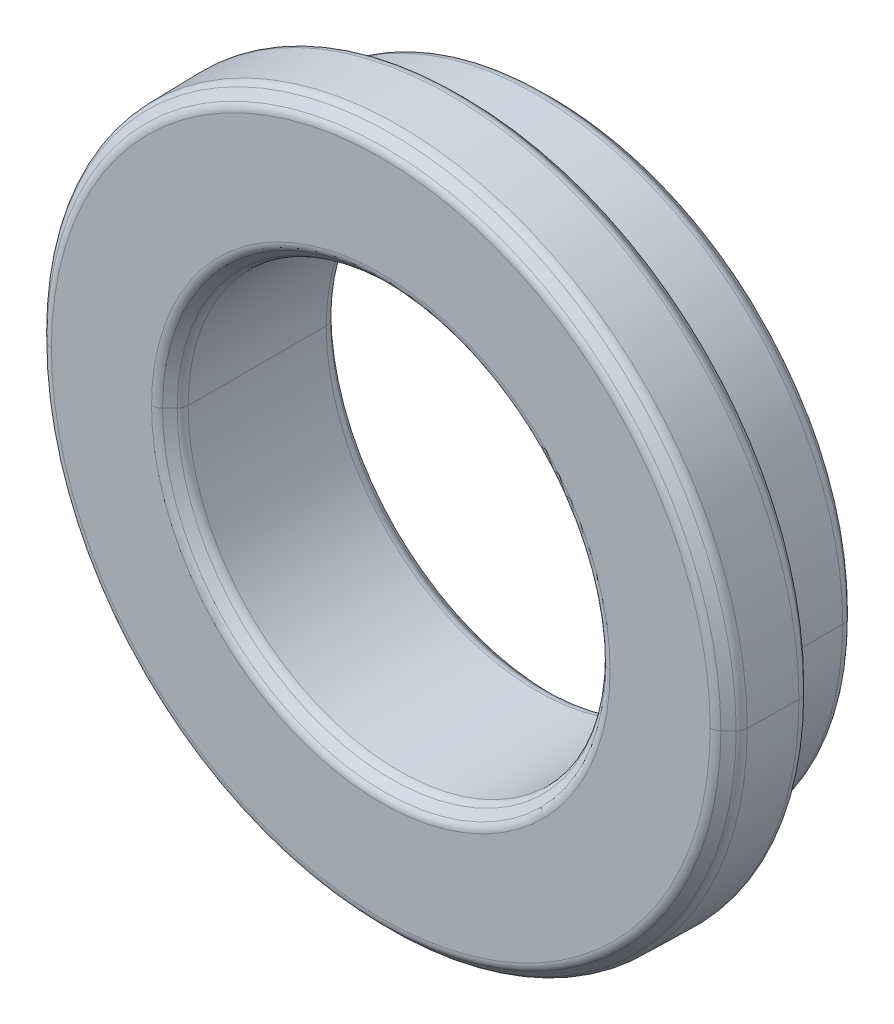
ISO-10303-21;
HEADER;
FILE_DESCRIPTION(('STEP AP214'),'2;1');
FILE_NAME('part.step','',(''),(''),'','','');
FILE_SCHEMA(('AUTOMOTIVE_DESIGN { 1 0 10303 214 1 1 1 1 }'));
ENDSEC;
DATA;
#1=APPLICATION_CONTEXT('core data for automotive mechanical design processes');
#2=APPLICATION_PROTOCOL_DEFINITION('international standard','automotive_design',2000,#1);
#3=PRODUCT_CONTEXT('',#1,'mechanical');
#4=PRODUCT('Part','Part','',(#3));
#5=PRODUCT_RELATED_PRODUCT_CATEGORY('part','',(#4));
#6=PRODUCT_DEFINITION_FORMATION('','',#4);
#7=PRODUCT_DEFINITION_CONTEXT('part definition',#1,'design');
#8=PRODUCT_DEFINITION('design','',#6,#7);
#9=PRODUCT_DEFINITION_SHAPE('','',#8);
#10=(LENGTH_UNIT() NAMED_UNIT(*) SI_UNIT(.MILLI.,.METRE.));
#11=(NAMED_UNIT(*) PLANE_ANGLE_UNIT() SI_UNIT($,.RADIAN.));
#12=(NAMED_UNIT(*) SI_UNIT($,.STERADIAN.) SOLID_ANGLE_UNIT());
#13=UNCERTAINTY_MEASURE_WITH_UNIT(LENGTH_MEASURE(1.E-05),#10,'distance_accuracy_value','');
#14=(GEOMETRIC_REPRESENTATION_CONTEXT(3) GLOBAL_UNCERTAINTY_ASSIGNED_CONTEXT((#13)) GLOBAL_UNIT_ASSIGNED_CONTEXT((#10,
#11,#12)) REPRESENTATION_CONTEXT('',''));
#15=CARTESIAN_POINT('',(0.,0.,0.));
#16=DIRECTION('',(0.,0.,1.));
#17=DIRECTION('',(1.,0.,0.));
#18=AXIS2_PLACEMENT_3D('',#15,#16,#17);
#19=CARTESIAN_POINT('',(0.,0.,1.3875));
#20=DIRECTION('',(0.,0.,-1.));
#21=DIRECTION('',(-1.,0.,0.));
#22=AXIS2_PLACEMENT_3D('',#19,#20,#21);
#23=TOROIDAL_SURFACE('',#22,5.98700479149173,0.2);
#24=CARTESIAN_POINT('',(5.98700479149173,0.,1.3875));
#25=DIRECTION('',(0.,1.,0.));
#26=DIRECTION('',(-1.,0.,0.));
#27=AXIS2_PLACEMENT_3D('',#24,#25,#26);
#28=CIRCLE('',#27,0.2);
#29=CARTESIAN_POINT('',(5.98700479149173,0.,1.5875));
#30=VERTEX_POINT('',#29);
#31=CARTESIAN_POINT('',(6.12593646558353,0.,1.53136796006773));
#32=VERTEX_POINT('',#31);
#33=EDGE_CURVE('E277',#30,#32,#28,.T.);
#34=ORIENTED_EDGE('',*,*,#33,.F.);
#35=CARTESIAN_POINT('',(0.,0.,1.5875));
#36=DIRECTION('',(0.,0.,1.));
#37=DIRECTION('',(-1.,0.,0.));
#38=AXIS2_PLACEMENT_3D('',#35,#36,#37);
#39=CIRCLE('',#38,5.98700479149173);
#40=CARTESIAN_POINT('',(-5.98700479149173,0.,1.5875));
#41=VERTEX_POINT('',#40);
#42=EDGE_CURVE('E172',#41,#30,#39,.T.);
#43=ORIENTED_EDGE('',*,*,#42,.F.);
#44=CARTESIAN_POINT('',(-5.98700479149173,0.,1.3875));
#45=DIRECTION('',(0.,-1.,0.));
#46=DIRECTION('',(0.,0.,-1.));
#47=AXIS2_PLACEMENT_3D('',#44,#45,#46);
#48=CIRCLE('',#47,0.2);
#49=CARTESIAN_POINT('',(-6.12593646558353,0.,1.53136796006773));
#50=VERTEX_POINT('',#49);
#51=EDGE_CURVE('E187',#41,#50,#48,.T.);
#52=ORIENTED_EDGE('',*,*,#51,.T.);
#53=CARTESIAN_POINT('',(0.,0.,1.53136796006773));
#54=DIRECTION('',(0.,0.,-1.));
#55=DIRECTION('',(-1.,0.,0.));
#56=AXIS2_PLACEMENT_3D('',#53,#54,#55);
#57=CIRCLE('',#56,6.12593646558353);
#58=EDGE_CURVE('E196',#32,#50,#57,.T.);
#59=ORIENTED_EDGE('',*,*,#58,.F.);
#60=EDGE_LOOP('',(#34,#43,#52,#59));
#61=FACE_BOUND('',#60,.T.);
#62=ADVANCED_FACE('F16',(#61),#23,.T.);
#63=CARTESIAN_POINT('',(0.,0.,1.3875));
#64=DIRECTION('',(0.,0.,-1.));
#65=DIRECTION('',(-1.,0.,0.));
#66=AXIS2_PLACEMENT_3D('',#63,#64,#65);
#67=TOROIDAL_SURFACE('',#66,4.16784271247462,0.2);
#68=CARTESIAN_POINT('',(4.16784271247462,0.,1.3875));
#69=DIRECTION('',(0.,1.,0.));
#70=DIRECTION('',(-1.,0.,0.));
#71=AXIS2_PLACEMENT_3D('',#68,#69,#70);
#72=CIRCLE('',#71,0.2);
#73=CARTESIAN_POINT('',(4.02642135623731,0.,1.5289213562373));
#74=VERTEX_POINT('',#73);
#75=CARTESIAN_POINT('',(4.16784271247462,0.,1.5875));
#76=VERTEX_POINT('',#75);
#77=EDGE_CURVE('E165',#74,#76,#72,.T.);
#78=ORIENTED_EDGE('',*,*,#77,.F.);
#79=CARTESIAN_POINT('',(0.,0.,1.5289213562373));
#80=DIRECTION('',(0.,0.,1.));
#81=DIRECTION('',(1.,0.,0.));
#82=AXIS2_PLACEMENT_3D('',#79,#80,#81);
#83=CIRCLE('',#82,4.02642135623732);
#84=CARTESIAN_POINT('',(-4.02642135623731,0.,1.5289213562373));
#85=VERTEX_POINT('',#84);
#86=EDGE_CURVE('E201',#85,#74,#83,.T.);
#87=ORIENTED_EDGE('',*,*,#86,.F.);
#88=CARTESIAN_POINT('',(-4.16784271247462,0.,1.3875));
#89=DIRECTION('',(0.,-1.,0.));
#90=DIRECTION('',(0.,0.,-1.));
#91=AXIS2_PLACEMENT_3D('',#88,#89,#90);
#92=CIRCLE('',#91,0.2);
#93=CARTESIAN_POINT('',(-4.16784271247462,0.,1.5875));
#94=VERTEX_POINT('',#93);
#95=EDGE_CURVE('E168',#85,#94,#92,.T.);
#96=ORIENTED_EDGE('',*,*,#95,.T.);
#97=CARTESIAN_POINT('',(0.,0.,1.5875));
#98=DIRECTION('',(0.,0.,-1.));
#99=DIRECTION('',(-1.,0.,0.));
#100=AXIS2_PLACEMENT_3D('',#97,#98,#99);
#101=CIRCLE('',#100,4.16784271247462);
#102=EDGE_CURVE('E152',#76,#94,#101,.T.);
#103=ORIENTED_EDGE('',*,*,#102,.F.);
#104=EDGE_LOOP('',(#78,#87,#96,#103));
#105=FACE_BOUND('',#104,.T.);
#106=ADVANCED_FACE('F163',(#105),#67,.T.);
#107=CARTESIAN_POINT('',(0.,0.,1.25465728752538));
#108=DIRECTION('',(0.,0.,-1.));
#109=DIRECTION('',(-1.,0.,0.));
#110=AXIS2_PLACEMENT_3D('',#107,#108,#109);
#111=TOROIDAL_SURFACE('',#110,4.035,0.2);
#112=CARTESIAN_POINT('',(4.035,0.,1.25465728752538));
#113=DIRECTION('',(0.,1.,0.));
#114=DIRECTION('',(-1.,0.,0.));
#115=AXIS2_PLACEMENT_3D('',#112,#113,#114);
#116=CIRCLE('',#115,0.2);
#117=CARTESIAN_POINT('',(3.835,0.,1.25465728752538));
#118=VERTEX_POINT('',#117);
#119=CARTESIAN_POINT('',(3.89357864376269,0.,1.39607864376268));
#120=VERTEX_POINT('',#119);
#121=EDGE_CURVE('E396',#118,#120,#116,.T.);
#122=ORIENTED_EDGE('',*,*,#121,.F.);
#123=CARTESIAN_POINT('',(0.,0.,1.25465728752538));
#124=DIRECTION('',(0.,0.,1.));
#125=DIRECTION('',(-1.,0.,0.));
#126=AXIS2_PLACEMENT_3D('',#123,#124,#125);
#127=CIRCLE('',#126,3.835);
#128=CARTESIAN_POINT('',(-3.835,0.,1.25465728752538));
#129=VERTEX_POINT('',#128);
#130=EDGE_CURVE('E301',#129,#118,#127,.T.);
#131=ORIENTED_EDGE('',*,*,#130,.F.);
#132=CARTESIAN_POINT('',(-4.035,0.,1.25465728752538));
#133=DIRECTION('',(0.,-1.,0.));
#134=DIRECTION('',(0.,0.,-1.));
#135=AXIS2_PLACEMENT_3D('',#132,#133,#134);
#136=CIRCLE('',#135,0.2);
#137=CARTESIAN_POINT('',(-3.89357864376269,0.,1.39607864376268));
#138=VERTEX_POINT('',#137);
#139=EDGE_CURVE('E321',#129,#138,#136,.T.);
#140=ORIENTED_EDGE('',*,*,#139,.T.);
#141=CARTESIAN_POINT('',(0.,0.,1.39607864376268));
#142=DIRECTION('',(0.,0.,-1.));
#143=DIRECTION('',(1.,0.,0.));
#144=AXIS2_PLACEMENT_3D('',#141,#142,#143);
#145=CIRCLE('',#144,3.89357864376269);
#146=EDGE_CURVE('E202',#120,#138,#145,.T.);
#147=ORIENTED_EDGE('',*,*,#146,.F.);
#148=EDGE_LOOP('',(#122,#131,#140,#147));
#149=FACE_BOUND('',#148,.T.);
#150=ADVANCED_FACE('F622',(#149),#111,.T.);
#151=CARTESIAN_POINT('',(0.,0.,-1.25465728752537));
#152=DIRECTION('',(0.,0.,1.));
#153=DIRECTION('',(1.,0.,0.));
#154=AXIS2_PLACEMENT_3D('',#151,#152,#153);
#155=TOROIDAL_SURFACE('',#154,4.035,0.2);
#156=CARTESIAN_POINT('',(-4.035,0.,-1.25465728752537));
#157=DIRECTION('',(0.,1.,0.));
#158=DIRECTION('',(-1.,0.,0.));
#159=AXIS2_PLACEMENT_3D('',#156,#157,#158);
#160=CIRCLE('',#159,0.2);
#161=CARTESIAN_POINT('',(-3.835,0.,-1.25465728752537));
#162=VERTEX_POINT('',#161);
#163=CARTESIAN_POINT('',(-3.89357864376269,0.,-1.39607864376268));
#164=VERTEX_POINT('',#163);
#165=EDGE_CURVE('E320',#162,#164,#160,.T.);
#166=ORIENTED_EDGE('',*,*,#165,.F.);
#167=CARTESIAN_POINT('',(0.,0.,-1.25465728752537));
#168=DIRECTION('',(0.,0.,-1.));
#169=DIRECTION('',(1.,0.,0.));
#170=AXIS2_PLACEMENT_3D('',#167,#168,#169);
#171=CIRCLE('',#170,3.835);
#172=CARTESIAN_POINT('',(3.835,0.,-1.25465728752537));
#173=VERTEX_POINT('',#172);
#174=EDGE_CURVE('E302',#173,#162,#171,.T.);
#175=ORIENTED_EDGE('',*,*,#174,.F.);
#176=CARTESIAN_POINT('',(4.035,0.,-1.25465728752537));
#177=DIRECTION('',(0.,-1.,0.));
#178=DIRECTION('',(0.,0.,-1.));
#179=AXIS2_PLACEMENT_3D('',#176,#177,#178);
#180=CIRCLE('',#179,0.2);
#181=CARTESIAN_POINT('',(3.89357864376269,0.,-1.39607864376268));
#182=VERTEX_POINT('',#181);
#183=EDGE_CURVE('E291',#173,#182,#180,.T.);
#184=ORIENTED_EDGE('',*,*,#183,.T.);
#185=CARTESIAN_POINT('',(0.,0.,-1.39607864376268));
#186=DIRECTION('',(0.,0.,1.));
#187=DIRECTION('',(-1.,0.,0.));
#188=AXIS2_PLACEMENT_3D('',#185,#186,#187);
#189=CIRCLE('',#188,3.89357864376269);
#190=EDGE_CURVE('E217',#164,#182,#189,.T.);
#191=ORIENTED_EDGE('',*,*,#190,.F.);
#192=EDGE_LOOP('',(#166,#175,#184,#191));
#193=FACE_BOUND('',#192,.T.);
#194=ADVANCED_FACE('F520',(#193),#155,.T.);
#195=CARTESIAN_POINT('',(0.,0.,1.25121749979519));
#196=DIRECTION('',(0.,0.,1.));
#197=DIRECTION('',(1.,0.,0.));
#198=AXIS2_PLACEMENT_3D('',#195,#196,#197);
#199=TOROIDAL_SURFACE('',#198,6.12812945169297,0.2);
#200=CARTESIAN_POINT('',(-6.12812945169297,0.,1.25121749979519));
#201=DIRECTION('',(0.,1.,0.));
#202=DIRECTION('',(-1.,0.,0.));
#203=AXIS2_PLACEMENT_3D('',#200,#201,#202);
#204=CIRCLE('',#203,0.2);
#205=CARTESIAN_POINT('',(-6.32809899072425,0.,1.25470798108265));
#206=VERTEX_POINT('',#205);
#207=CARTESIAN_POINT('',(-6.26706112578477,0.,1.39508545986292));
#208=VERTEX_POINT('',#207);
#209=EDGE_CURVE('E369',#206,#208,#204,.T.);
#210=ORIENTED_EDGE('',*,*,#209,.F.);
#211=CARTESIAN_POINT('',(0.,0.,1.25470798108265));
#212=DIRECTION('',(0.,0.,-1.));
#213=DIRECTION('',(-1.,0.,0.));
#214=AXIS2_PLACEMENT_3D('',#211,#212,#213);
#215=CIRCLE('',#214,6.32809899072425);
#216=CARTESIAN_POINT('',(6.32809899072425,0.,1.25470798108265));
#217=VERTEX_POINT('',#216);
#218=EDGE_CURVE('E264',#217,#206,#215,.T.);
#219=ORIENTED_EDGE('',*,*,#218,.F.);
#220=CARTESIAN_POINT('',(6.12812945169297,0.,1.25121749979519));
#221=DIRECTION('',(0.,-1.,0.));
#222=DIRECTION('',(0.,0.,-1.));
#223=AXIS2_PLACEMENT_3D('',#220,#221,#222);
#224=CIRCLE('',#223,0.2);
#225=CARTESIAN_POINT('',(6.26706112578477,0.,1.39508545986292));
#226=VERTEX_POINT('',#225);
#227=EDGE_CURVE('E331',#217,#226,#224,.T.);
#228=ORIENTED_EDGE('',*,*,#227,.T.);
#229=CARTESIAN_POINT('',(0.,0.,1.39508545986292));
#230=DIRECTION('',(0.,0.,1.));
#231=DIRECTION('',(-1.,0.,0.));
#232=AXIS2_PLACEMENT_3D('',#229,#230,#231);
#233=CIRCLE('',#232,6.26706112578477);
#234=EDGE_CURVE('E192',#208,#226,#233,.T.);
#235=ORIENTED_EDGE('',*,*,#234,.F.);
#236=EDGE_LOOP('',(#210,#219,#228,#235));
#237=FACE_BOUND('',#236,.T.);
#238=ADVANCED_FACE('F649',(#237),#199,.T.);
#239=CARTESIAN_POINT('',(0.,0.,0.327102648891243));
#240=DIRECTION('',(0.,0.,-1.));
#241=DIRECTION('',(-1.,0.,0.));
#242=AXIS2_PLACEMENT_3D('',#239,#240,#241);
#243=TOROIDAL_SURFACE('',#242,6.14425993641663,0.2);
#244=CARTESIAN_POINT('',(6.14425993641663,0.,0.327102648891243));
#245=DIRECTION('',(0.,1.,0.));
#246=DIRECTION('',(-1.,0.,0.));
#247=AXIS2_PLACEMENT_3D('',#244,#245,#246);
#248=CIRCLE('',#247,0.2);
#249=CARTESIAN_POINT('',(6.34422947544791,0.,0.3305931301787));
#250=VERTEX_POINT('',#249);
#251=CARTESIAN_POINT('',(6.28568129265394,0.,0.185681292653931));
#252=VERTEX_POINT('',#251);
#253=EDGE_CURVE('E330',#250,#252,#248,.T.);
#254=ORIENTED_EDGE('',*,*,#253,.F.);
#255=CARTESIAN_POINT('',(0.,0.,0.3305931301787));
#256=DIRECTION('',(0.,0.,1.));
#257=DIRECTION('',(-1.,0.,0.));
#258=AXIS2_PLACEMENT_3D('',#255,#256,#257);
#259=CIRCLE('',#258,6.34422947544791);
#260=CARTESIAN_POINT('',(-6.34422947544791,0.,0.3305931301787));
#261=VERTEX_POINT('',#260);
#262=EDGE_CURVE('E276',#261,#250,#259,.T.);
#263=ORIENTED_EDGE('',*,*,#262,.F.);
#264=CARTESIAN_POINT('',(-6.14425993641663,0.,0.327102648891243));
#265=DIRECTION('',(0.,-1.,0.));
#266=DIRECTION('',(0.,0.,-1.));
#267=AXIS2_PLACEMENT_3D('',#264,#265,#266);
#268=CIRCLE('',#267,0.2);
#269=CARTESIAN_POINT('',(-6.28568129265394,0.,0.185681292653931));
#270=VERTEX_POINT('',#269);
#271=EDGE_CURVE('E236',#261,#270,#268,.T.);
#272=ORIENTED_EDGE('',*,*,#271,.T.);
#273=CARTESIAN_POINT('',(0.,0.,0.185681292653931));
#274=DIRECTION('',(0.,0.,-1.));
#275=DIRECTION('',(1.,0.,0.));
#276=AXIS2_PLACEMENT_3D('',#273,#274,#275);
#277=CIRCLE('',#276,6.28568129265394);
#278=EDGE_CURVE('E206',#252,#270,#277,.T.);
#279=ORIENTED_EDGE('',*,*,#278,.F.);
#280=EDGE_LOOP('',(#254,#263,#272,#279));
#281=FACE_BOUND('',#280,.T.);
#282=ADVANCED_FACE('F646',(#281),#243,.T.);
#283=CARTESIAN_POINT('',(0.,0.,0.2));
#284=DIRECTION('',(0.,0.,1.));
#285=DIRECTION('',(1.,0.,0.));
#286=AXIS2_PLACEMENT_3D('',#283,#284,#285);
#287=TOROIDAL_SURFACE('',#286,6.01715728752538,0.2);
#288=CARTESIAN_POINT('',(-6.01715728752538,0.,0.2));
#289=DIRECTION('',(0.,1.,0.));
#290=DIRECTION('',(-1.,0.,0.));
#291=AXIS2_PLACEMENT_3D('',#288,#289,#290);
#292=CIRCLE('',#291,0.2);
#293=CARTESIAN_POINT('',(-6.01715728752538,0.,0.));
#294=VERTEX_POINT('',#293);
#295=CARTESIAN_POINT('',(-6.15857864376269,0.,0.0585786437626874));
#296=VERTEX_POINT('',#295);
#297=EDGE_CURVE('E218',#294,#296,#292,.T.);
#298=ORIENTED_EDGE('',*,*,#297,.F.);
#299=CARTESIAN_POINT('',(0.,0.,0.));
#300=DIRECTION('',(0.,0.,-1.));
#301=DIRECTION('',(1.,0.,0.));
#302=AXIS2_PLACEMENT_3D('',#299,#300,#301);
#303=CIRCLE('',#302,6.01715728752538);
#304=CARTESIAN_POINT('',(6.01715728752538,0.,0.));
#305=VERTEX_POINT('',#304);
#306=EDGE_CURVE('E306',#305,#294,#303,.T.);
#307=ORIENTED_EDGE('',*,*,#306,.F.);
#308=CARTESIAN_POINT('',(6.01715728752538,0.,0.2));
#309=DIRECTION('',(0.,-1.,0.));
#310=DIRECTION('',(0.,0.,-1.));
#311=AXIS2_PLACEMENT_3D('',#308,#309,#310);
#312=CIRCLE('',#311,0.2);
#313=CARTESIAN_POINT('',(6.15857864376269,0.,0.0585786437626874));
#314=VERTEX_POINT('',#313);
#315=EDGE_CURVE('E373',#305,#314,#312,.T.);
#316=ORIENTED_EDGE('',*,*,#315,.T.);
#317=CARTESIAN_POINT('',(0.,0.,0.0585786437626874));
#318=DIRECTION('',(0.,0.,1.));
#319=DIRECTION('',(1.,0.,0.));
#320=AXIS2_PLACEMENT_3D('',#317,#318,#319);
#321=CIRCLE('',#320,6.15857864376269);
#322=EDGE_CURVE('E195',#296,#314,#321,.T.);
#323=ORIENTED_EDGE('',*,*,#322,.F.);
#324=EDGE_LOOP('',(#298,#307,#316,#323));
#325=FACE_BOUND('',#324,.T.);
#326=ADVANCED_FACE('F594',(#325),#287,.T.);
#327=CARTESIAN_POINT('',(0.,0.,-0.2));
#328=DIRECTION('',(0.,0.,1.));
#329=DIRECTION('',(1.,0.,0.));
#330=AXIS2_PLACEMENT_3D('',#327,#328,#329);
#331=TOROIDAL_SURFACE('',#330,5.75625,0.2);
#332=CARTESIAN_POINT('',(-5.75625,0.,-0.2));
#333=DIRECTION('',(0.,1.,0.));
#334=DIRECTION('',(-1.,0.,0.));
#335=AXIS2_PLACEMENT_3D('',#332,#333,#334);
#336=CIRCLE('',#335,0.2);
#337=CARTESIAN_POINT('',(-5.75625,0.,0.));
#338=VERTEX_POINT('',#337);
#339=CARTESIAN_POINT('',(-5.55625,0.,-0.2));
#340=VERTEX_POINT('',#339);
#341=EDGE_CURVE('E387',#338,#340,#336,.T.);
#342=ORIENTED_EDGE('',*,*,#341,.F.);
#343=CARTESIAN_POINT('',(0.,0.,0.));
#344=DIRECTION('',(0.,0.,1.));
#345=DIRECTION('',(1.,0.,0.));
#346=AXIS2_PLACEMENT_3D('',#343,#344,#345);
#347=CIRCLE('',#346,5.75625);
#348=CARTESIAN_POINT('',(5.75625,0.,0.));
#349=VERTEX_POINT('',#348);
#350=EDGE_CURVE('E310',#349,#338,#347,.T.);
#351=ORIENTED_EDGE('',*,*,#350,.F.);
#352=CARTESIAN_POINT('',(5.75625,0.,-0.2));
#353=DIRECTION('',(0.,-1.,0.));
#354=DIRECTION('',(0.,0.,-1.));
#355=AXIS2_PLACEMENT_3D('',#352,#353,#354);
#356=CIRCLE('',#355,0.2);
#357=CARTESIAN_POINT('',(5.55625,0.,-0.2));
#358=VERTEX_POINT('',#357);
#359=EDGE_CURVE('E335',#349,#358,#356,.T.);
#360=ORIENTED_EDGE('',*,*,#359,.T.);
#361=CARTESIAN_POINT('',(0.,0.,-0.2));
#362=DIRECTION('',(0.,0.,-1.));
#363=DIRECTION('',(1.,0.,0.));
#364=AXIS2_PLACEMENT_3D('',#361,#362,#363);
#365=CIRCLE('',#364,5.55625);
#366=EDGE_CURVE('E426',#340,#358,#365,.T.);
#367=ORIENTED_EDGE('',*,*,#366,.F.);
#368=EDGE_LOOP('',(#342,#351,#360,#367));
#369=FACE_BOUND('',#368,.T.);
#370=ADVANCED_FACE('F654',(#369),#331,.F.);
#371=CARTESIAN_POINT('',(0.,0.,-1.25465728752538));
#372=DIRECTION('',(0.,0.,-1.));
#373=DIRECTION('',(-1.,0.,0.));
#374=AXIS2_PLACEMENT_3D('',#371,#372,#373);
#375=TOROIDAL_SURFACE('',#374,5.35625,0.2);
#376=CARTESIAN_POINT('',(5.35625,0.,-1.25465728752538));
#377=DIRECTION('',(0.,1.,0.));
#378=DIRECTION('',(-1.,0.,0.));
#379=AXIS2_PLACEMENT_3D('',#376,#377,#378);
#380=CIRCLE('',#379,0.2);
#381=CARTESIAN_POINT('',(5.55625,0.,-1.25465728752538));
#382=VERTEX_POINT('',#381);
#383=CARTESIAN_POINT('',(5.49767135623731,0.,-1.39607864376269));
#384=VERTEX_POINT('',#383);
#385=EDGE_CURVE('E341',#382,#384,#380,.T.);
#386=ORIENTED_EDGE('',*,*,#385,.F.);
#387=CARTESIAN_POINT('',(0.,0.,-1.25465728752538));
#388=DIRECTION('',(0.,0.,1.));
#389=DIRECTION('',(-1.,0.,0.));
#390=AXIS2_PLACEMENT_3D('',#387,#388,#389);
#391=CIRCLE('',#390,5.55625);
#392=CARTESIAN_POINT('',(-5.55625,0.,-1.25465728752538));
#393=VERTEX_POINT('',#392);
#394=EDGE_CURVE('E311',#393,#382,#391,.T.);
#395=ORIENTED_EDGE('',*,*,#394,.F.);
#396=CARTESIAN_POINT('',(-5.35625,0.,-1.25465728752538));
#397=DIRECTION('',(0.,-1.,0.));
#398=DIRECTION('',(0.,0.,-1.));
#399=AXIS2_PLACEMENT_3D('',#396,#397,#398);
#400=CIRCLE('',#399,0.2);
#401=CARTESIAN_POINT('',(-5.49767135623731,0.,-1.39607864376269));
#402=VERTEX_POINT('',#401);
#403=EDGE_CURVE('E357',#393,#402,#400,.T.);
#404=ORIENTED_EDGE('',*,*,#403,.T.);
#405=CARTESIAN_POINT('',(0.,0.,-1.39607864376269));
#406=DIRECTION('',(0.,0.,-1.));
#407=DIRECTION('',(1.,0.,0.));
#408=AXIS2_PLACEMENT_3D('',#405,#406,#407);
#409=CIRCLE('',#408,5.49767135623731);
#410=EDGE_CURVE('E10',#384,#402,#409,.T.);
#411=ORIENTED_EDGE('',*,*,#410,.F.);
#412=EDGE_LOOP('',(#386,#395,#404,#411));
#413=FACE_BOUND('',#412,.T.);
#414=ADVANCED_FACE('F657',(#413),#375,.T.);
#415=CARTESIAN_POINT('',(0.,0.,-1.3875));
#416=DIRECTION('',(0.,0.,1.));
#417=DIRECTION('',(1.,0.,0.));
#418=AXIS2_PLACEMENT_3D('',#415,#416,#417);
#419=TOROIDAL_SURFACE('',#418,5.22340728752538,0.2);
#420=CARTESIAN_POINT('',(-5.22340728752538,0.,-1.3875));
#421=DIRECTION('',(0.,1.,0.));
#422=DIRECTION('',(-1.,0.,0.));
#423=AXIS2_PLACEMENT_3D('',#420,#421,#422);
#424=CIRCLE('',#423,0.2);
#425=CARTESIAN_POINT('',(-5.22340728752538,0.,-1.5875));
#426=VERTEX_POINT('',#425);
#427=CARTESIAN_POINT('',(-5.36482864376269,0.,-1.5289213562373));
#428=VERTEX_POINT('',#427);
#429=EDGE_CURVE('E241',#426,#428,#424,.T.);
#430=ORIENTED_EDGE('',*,*,#429,.F.);
#431=CARTESIAN_POINT('',(0.,0.,-1.5875));
#432=DIRECTION('',(0.,0.,-1.));
#433=DIRECTION('',(1.,0.,0.));
#434=AXIS2_PLACEMENT_3D('',#431,#432,#433);
#435=CIRCLE('',#434,5.22340728752538);
#436=CARTESIAN_POINT('',(5.22340728752538,0.,-1.5875));
#437=VERTEX_POINT('',#436);
#438=EDGE_CURVE('E171',#437,#426,#435,.T.);
#439=ORIENTED_EDGE('',*,*,#438,.F.);
#440=CARTESIAN_POINT('',(5.22340728752538,0.,-1.3875));
#441=DIRECTION('',(0.,-1.,0.));
#442=DIRECTION('',(0.,0.,-1.));
#443=AXIS2_PLACEMENT_3D('',#440,#441,#442);
#444=CIRCLE('',#443,0.2);
#445=CARTESIAN_POINT('',(5.36482864376269,0.,-1.5289213562373));
#446=VERTEX_POINT('',#445);
#447=EDGE_CURVE('E240',#437,#446,#444,.T.);
#448=ORIENTED_EDGE('',*,*,#447,.T.);
#449=CARTESIAN_POINT('',(0.,0.,-1.5289213562373));
#450=DIRECTION('',(0.,0.,1.));
#451=DIRECTION('',(1.,0.,0.));
#452=AXIS2_PLACEMENT_3D('',#449,#450,#451);
#453=CIRCLE('',#452,5.36482864376269);
#454=EDGE_CURVE('E27',#428,#446,#453,.T.);
#455=ORIENTED_EDGE('',*,*,#454,.F.);
#456=EDGE_LOOP('',(#430,#439,#448,#455));
#457=FACE_BOUND('',#456,.T.);
#458=ADVANCED_FACE('F866',(#457),#419,.T.);
#459=CARTESIAN_POINT('',(0.,0.,-1.3875));
#460=DIRECTION('',(0.,0.,1.));
#461=DIRECTION('',(1.,0.,0.));
#462=AXIS2_PLACEMENT_3D('',#459,#460,#461);
#463=TOROIDAL_SURFACE('',#462,4.16784271247462,0.2);
#464=CARTESIAN_POINT('',(-4.16784271247462,0.,-1.3875));
#465=DIRECTION('',(0.,1.,0.));
#466=DIRECTION('',(-1.,0.,0.));
#467=AXIS2_PLACEMENT_3D('',#464,#465,#466);
#468=CIRCLE('',#467,0.2);
#469=CARTESIAN_POINT('',(-4.02642135623731,0.,-1.5289213562373));
#470=VERTEX_POINT('',#469);
#471=CARTESIAN_POINT('',(-4.16784271247462,0.,-1.5875));
#472=VERTEX_POINT('',#471);
#473=EDGE_CURVE('E224',#470,#472,#468,.T.);
#474=ORIENTED_EDGE('',*,*,#473,.F.);
#475=CARTESIAN_POINT('',(0.,0.,-1.5289213562373));
#476=DIRECTION('',(0.,0.,-1.));
#477=DIRECTION('',(-1.,0.,0.));
#478=AXIS2_PLACEMENT_3D('',#475,#476,#477);
#479=CIRCLE('',#478,4.02642135623731);
#480=CARTESIAN_POINT('',(4.02642135623731,0.,-1.5289213562373));
#481=VERTEX_POINT('',#480);
#482=EDGE_CURVE('E286',#481,#470,#479,.T.);
#483=ORIENTED_EDGE('',*,*,#482,.F.);
#484=CARTESIAN_POINT('',(4.16784271247462,0.,-1.3875));
#485=DIRECTION('',(0.,-1.,0.));
#486=DIRECTION('',(0.,0.,-1.));
#487=AXIS2_PLACEMENT_3D('',#484,#485,#486);
#488=CIRCLE('',#487,0.2);
#489=CARTESIAN_POINT('',(4.16784271247462,0.,-1.5875));
#490=VERTEX_POINT('',#489);
#491=EDGE_CURVE('E232',#481,#490,#488,.T.);
#492=ORIENTED_EDGE('',*,*,#491,.T.);
#493=CARTESIAN_POINT('',(0.,0.,-1.5875));
#494=DIRECTION('',(0.,0.,1.));
#495=DIRECTION('',(1.,0.,0.));
#496=AXIS2_PLACEMENT_3D('',#493,#494,#495);
#497=CIRCLE('',#496,4.16784271247462);
#498=EDGE_CURVE('E41',#472,#490,#497,.T.);
#499=ORIENTED_EDGE('',*,*,#498,.F.);
#500=EDGE_LOOP('',(#474,#483,#492,#499));
#501=FACE_BOUND('',#500,.T.);
#502=ADVANCED_FACE('F18',(#501),#463,.T.);
#503=CARTESIAN_POINT('',(0.,0.,1.3375));
#504=DIRECTION('',(0.,0.,1.));
#505=DIRECTION('',(1.,0.,0.));
#506=AXIS2_PLACEMENT_3D('',#503,#504,#505);
#507=CONICAL_SURFACE('',#506,3.835,0.785398163397448);
#508=DIRECTION('',(-0.707106781186547,0.,0.707106781186548));
#509=VECTOR('',#508,1.);
#510=CARTESIAN_POINT('',(-3.835,0.,1.3375));
#511=LINE('',#510,#509);
#512=EDGE_CURVE('E197',#138,#85,#511,.T.);
#513=ORIENTED_EDGE('',*,*,#512,.F.);
#514=CARTESIAN_POINT('',(0.,0.,1.39607864376268));
#515=DIRECTION('',(0.,0.,-1.));
#516=DIRECTION('',(1.,0.,0.));
#517=AXIS2_PLACEMENT_3D('',#514,#515,#516);
#518=CIRCLE('',#517,3.89357864376269);
#519=EDGE_CURVE('E361',#138,#120,#518,.T.);
#520=ORIENTED_EDGE('',*,*,#519,.T.);
#521=DIRECTION('',(0.707106781186547,0.,0.707106781186548));
#522=VECTOR('',#521,1.);
#523=CARTESIAN_POINT('',(3.835,0.,1.3375));
#524=LINE('',#523,#522);
#525=EDGE_CURVE('E213',#120,#74,#524,.T.);
#526=ORIENTED_EDGE('',*,*,#525,.T.);
#527=CARTESIAN_POINT('',(0.,0.,1.5289213562373));
#528=DIRECTION('',(0.,0.,1.));
#529=DIRECTION('',(1.,0.,0.));
#530=AXIS2_PLACEMENT_3D('',#527,#528,#529);
#531=CIRCLE('',#530,4.02642135623732);
#532=EDGE_CURVE('E180',#74,#85,#531,.T.);
#533=ORIENTED_EDGE('',*,*,#532,.T.);
#534=EDGE_LOOP('',(#513,#520,#526,#533));
#535=FACE_BOUND('',#534,.T.);
#536=ADVANCED_FACE('F706',(#535),#507,.F.);
#537=CARTESIAN_POINT('',(0.,0.,-1.5875));
#538=DIRECTION('',(0.,0.,-1.));
#539=DIRECTION('',(-1.,0.,0.));
#540=AXIS2_PLACEMENT_3D('',#537,#538,#539);
#541=CONICAL_SURFACE('',#540,4.085,0.785398163397443);
#542=DIRECTION('',(0.707106781186545,0.,-0.707106781186551));
#543=VECTOR('',#542,1.);
#544=CARTESIAN_POINT('',(4.085,0.,-1.5875));
#545=LINE('',#544,#543);
#546=EDGE_CURVE('E282',#182,#481,#545,.T.);
#547=ORIENTED_EDGE('',*,*,#546,.F.);
#548=CARTESIAN_POINT('',(0.,0.,-1.39607864376268));
#549=DIRECTION('',(0.,0.,1.));
#550=DIRECTION('',(-1.,0.,0.));
#551=AXIS2_PLACEMENT_3D('',#548,#549,#550);
#552=CIRCLE('',#551,3.89357864376269);
#553=EDGE_CURVE('E295',#182,#164,#552,.T.);
#554=ORIENTED_EDGE('',*,*,#553,.T.);
#555=DIRECTION('',(-0.707106781186545,0.,-0.707106781186551));
#556=VECTOR('',#555,1.);
#557=CARTESIAN_POINT('',(-4.085,0.,-1.5875));
#558=LINE('',#557,#556);
#559=EDGE_CURVE('E404',#164,#470,#558,.T.);
#560=ORIENTED_EDGE('',*,*,#559,.T.);
#561=CARTESIAN_POINT('',(0.,0.,-1.5289213562373));
#562=DIRECTION('',(0.,0.,-1.));
#563=DIRECTION('',(-1.,0.,0.));
#564=AXIS2_PLACEMENT_3D('',#561,#562,#563);
#565=CIRCLE('',#564,4.02642135623731);
#566=EDGE_CURVE('E229',#470,#481,#565,.T.);
#567=ORIENTED_EDGE('',*,*,#566,.T.);
#568=EDGE_LOOP('',(#547,#554,#560,#567));
#569=FACE_BOUND('',#568,.T.);
#570=ADVANCED_FACE('F627',(#569),#541,.F.);
#571=CARTESIAN_POINT('',(0.,0.,-1.3375));
#572=DIRECTION('',(0.,0.,1.));
#573=DIRECTION('',(1.,0.,0.));
#574=AXIS2_PLACEMENT_3D('',#571,#572,#573);
#575=CONICAL_SURFACE('',#574,5.55625,0.785398163397448);
#576=DIRECTION('',(-0.707106781186548,0.,0.707106781186548));
#577=VECTOR('',#576,1.);
#578=CARTESIAN_POINT('',(-5.55625,0.,-1.3375));
#579=LINE('',#578,#577);
#580=EDGE_CURVE('E325',#428,#402,#579,.T.);
#581=ORIENTED_EDGE('',*,*,#580,.F.);
#582=ORIENTED_EDGE('',*,*,#454,.T.);
#583=DIRECTION('',(0.707106781186548,0.,0.707106781186548));
#584=VECTOR('',#583,1.);
#585=CARTESIAN_POINT('',(5.55625,0.,-1.3375));
#586=LINE('',#585,#584);
#587=EDGE_CURVE('E212',#446,#384,#586,.T.);
#588=ORIENTED_EDGE('',*,*,#587,.T.);
#589=ORIENTED_EDGE('',*,*,#410,.T.);
#590=EDGE_LOOP('',(#581,#582,#588,#589));
#591=FACE_BOUND('',#590,.T.);
#592=ADVANCED_FACE('F1014',(#591),#575,.T.);
#593=CARTESIAN_POINT('',(0.,0.,0.245711096850879));
#594=DIRECTION('',(0.,0.,1.));
#595=DIRECTION('',(1.,0.,0.));
#596=AXIS2_PLACEMENT_3D('',#593,#594,#595);
#597=CONICAL_SURFACE('',#596,6.34571109685089,0.785398163397453);
#598=DIRECTION('',(-0.707106781186551,0.,0.707106781186544));
#599=VECTOR('',#598,1.);
#600=CARTESIAN_POINT('',(-6.34571109685089,0.,0.245711096850879));
#601=LINE('',#600,#599);
#602=EDGE_CURVE('E207',#296,#270,#601,.T.);
#603=ORIENTED_EDGE('',*,*,#602,.F.);
#604=ORIENTED_EDGE('',*,*,#322,.T.);
#605=DIRECTION('',(0.707106781186551,0.,0.707106781186544));
#606=VECTOR('',#605,1.);
#607=CARTESIAN_POINT('',(6.34571109685089,0.,0.245711096850879));
#608=LINE('',#607,#606);
#609=EDGE_CURVE('E211',#314,#252,#608,.T.);
#610=ORIENTED_EDGE('',*,*,#609,.T.);
#611=ORIENTED_EDGE('',*,*,#278,.T.);
#612=EDGE_LOOP('',(#603,#604,#610,#611));
#613=FACE_BOUND('',#612,.T.);
#614=ADVANCED_FACE('F666',(#613),#597,.T.);
#615=CARTESIAN_POINT('',(0.,0.,1.5875));
#616=DIRECTION('',(0.,0.,-1.));
#617=DIRECTION('',(-1.,0.,0.));
#618=AXIS2_PLACEMENT_3D('',#615,#616,#617);
#619=CONICAL_SURFACE('',#618,6.06781003665876,0.802851455917387);
#620=DIRECTION('',(0.719339800338648,0.,-0.694658370459001));
#621=VECTOR('',#620,1.);
#622=CARTESIAN_POINT('',(6.06781003665876,0.,1.5875));
#623=LINE('',#622,#621);
#624=EDGE_CURVE('E244',#32,#226,#623,.T.);
#625=ORIENTED_EDGE('',*,*,#624,.F.);
#626=ORIENTED_EDGE('',*,*,#58,.T.);
#627=DIRECTION('',(-0.719339800338648,0.,-0.694658370459001));
#628=VECTOR('',#627,1.);
#629=CARTESIAN_POINT('',(-6.06781003665876,0.,1.5875));
#630=LINE('',#629,#628);
#631=EDGE_CURVE('E253',#50,#208,#630,.T.);
#632=ORIENTED_EDGE('',*,*,#631,.T.);
#633=ORIENTED_EDGE('',*,*,#234,.T.);
#634=EDGE_LOOP('',(#625,#626,#632,#633));
#635=FACE_BOUND('',#634,.T.);
#636=ADVANCED_FACE('F611',(#635),#619,.T.);
#637=CARTESIAN_POINT('',(0.,0.,0.));
#638=DIRECTION('',(0.,0.,-1.));
#639=DIRECTION('',(1.,0.,0.));
#640=AXIS2_PLACEMENT_3D('',#637,#638,#639);
#641=CONICAL_SURFACE('',#640,6.35,0.0174532925199415);
#642=DIRECTION('',(-0.0174524064372835,0.,-0.999847695156391));
#643=VECTOR('',#642,1.);
#644=CARTESIAN_POINT('',(-6.35,0.,0.));
#645=LINE('',#644,#643);
#646=EDGE_CURVE('E290',#206,#261,#645,.T.);
#647=ORIENTED_EDGE('',*,*,#646,.F.);
#648=CARTESIAN_POINT('',(0.,0.,1.25470798108265));
#649=DIRECTION('',(0.,0.,-1.));
#650=DIRECTION('',(-1.,0.,0.));
#651=AXIS2_PLACEMENT_3D('',#648,#649,#650);
#652=CIRCLE('',#651,6.32809899072425);
#653=EDGE_CURVE('E294',#206,#217,#652,.T.);
#654=ORIENTED_EDGE('',*,*,#653,.T.);
#655=DIRECTION('',(0.0174524064372835,0.,-0.999847695156391));
#656=VECTOR('',#655,1.);
#657=CARTESIAN_POINT('',(6.35,0.,0.));
#658=LINE('',#657,#656);
#659=EDGE_CURVE('E272',#217,#250,#658,.T.);
#660=ORIENTED_EDGE('',*,*,#659,.T.);
#661=CARTESIAN_POINT('',(0.,0.,0.3305931301787));
#662=DIRECTION('',(0.,0.,1.));
#663=DIRECTION('',(-1.,0.,0.));
#664=AXIS2_PLACEMENT_3D('',#661,#662,#663);
#665=CIRCLE('',#664,6.34422947544791);
#666=EDGE_CURVE('E326',#250,#261,#665,.T.);
#667=ORIENTED_EDGE('',*,*,#666,.T.);
#668=EDGE_LOOP('',(#647,#654,#660,#667));
#669=FACE_BOUND('',#668,.T.);
#670=ADVANCED_FACE('F602',(#669),#641,.T.);
#671=CARTESIAN_POINT('',(-5.55625,0.,0.));
#672=DIRECTION('',(0.,0.,1.));
#673=DIRECTION('',(1.,0.,0.));
#674=AXIS2_PLACEMENT_3D('',#671,#672,#673);
#675=PLANE('',#674);
#676=ORIENTED_EDGE('',*,*,#350,.T.);
#677=CARTESIAN_POINT('',(0.,0.,0.));
#678=DIRECTION('',(0.,0.,1.));
#679=DIRECTION('',(1.,0.,0.));
#680=AXIS2_PLACEMENT_3D('',#677,#678,#679);
#681=CIRCLE('',#680,5.75625);
#682=EDGE_CURVE('E377',#338,#349,#681,.T.);
#683=ORIENTED_EDGE('',*,*,#682,.T.);
#684=EDGE_LOOP('',(#676,#683));
#685=FACE_BOUND('',#684,.T.);
#686=ORIENTED_EDGE('',*,*,#306,.T.);
#687=CARTESIAN_POINT('',(0.,0.,0.));
#688=DIRECTION('',(0.,0.,-1.));
#689=DIRECTION('',(1.,0.,0.));
#690=AXIS2_PLACEMENT_3D('',#687,#688,#689);
#691=CIRCLE('',#690,6.01715728752538);
#692=EDGE_CURVE('E223',#294,#305,#691,.T.);
#693=ORIENTED_EDGE('',*,*,#692,.T.);
#694=EDGE_LOOP('',(#686,#693));
#695=FACE_BOUND('',#694,.T.);
#696=ADVANCED_FACE('F600',(#685,#695),#675,.F.);
#697=CARTESIAN_POINT('',(0.,0.,10.5788114163766));
#698=DIRECTION('',(0.,0.,1.));
#699=DIRECTION('',(1.,0.,0.));
#700=AXIS2_PLACEMENT_3D('',#697,#698,#699);
#701=CYLINDRICAL_SURFACE('',#700,5.55625);
#702=DIRECTION('',(0.,0.,1.));
#703=VECTOR('',#702,1.);
#704=CARTESIAN_POINT('',(-5.55625,0.,10.5788114163766));
#705=LINE('',#704,#703);
#706=EDGE_CURVE('E275',#393,#340,#705,.T.);
#707=ORIENTED_EDGE('',*,*,#706,.F.);
#708=ORIENTED_EDGE('',*,*,#394,.T.);
#709=DIRECTION('',(0.,0.,1.));
#710=VECTOR('',#709,1.);
#711=CARTESIAN_POINT('',(5.55625,0.,10.5788114163766));
#712=LINE('',#711,#710);
#713=EDGE_CURVE('E430',#382,#358,#712,.T.);
#714=ORIENTED_EDGE('',*,*,#713,.T.);
#715=CARTESIAN_POINT('',(0.,0.,-0.2));
#716=DIRECTION('',(0.,0.,-1.));
#717=DIRECTION('',(1.,0.,0.));
#718=AXIS2_PLACEMENT_3D('',#715,#716,#717);
#719=CIRCLE('',#718,5.55625);
#720=EDGE_CURVE('E340',#358,#340,#719,.T.);
#721=ORIENTED_EDGE('',*,*,#720,.T.);
#722=EDGE_LOOP('',(#707,#708,#714,#721));
#723=FACE_BOUND('',#722,.T.);
#724=ADVANCED_FACE('F479',(#723),#701,.T.);
#725=CARTESIAN_POINT('',(-3.835,0.,-1.5875));
#726=DIRECTION('',(0.,0.,1.));
#727=DIRECTION('',(1.,0.,0.));
#728=AXIS2_PLACEMENT_3D('',#725,#726,#727);
#729=PLANE('',#728);
#730=CARTESIAN_POINT('',(0.,0.,-1.5875));
#731=DIRECTION('',(0.,0.,1.));
#732=DIRECTION('',(1.,0.,0.));
#733=AXIS2_PLACEMENT_3D('',#730,#731,#732);
#734=CIRCLE('',#733,4.16784271247462);
#735=EDGE_CURVE('E228',#490,#472,#734,.T.);
#736=ORIENTED_EDGE('',*,*,#735,.T.);
#737=ORIENTED_EDGE('',*,*,#498,.T.);
#738=EDGE_LOOP('',(#736,#737));
#739=FACE_BOUND('',#738,.T.);
#740=ORIENTED_EDGE('',*,*,#438,.T.);
#741=CARTESIAN_POINT('',(0.,0.,-1.5875));
#742=DIRECTION('',(0.,0.,-1.));
#743=DIRECTION('',(1.,0.,0.));
#744=AXIS2_PLACEMENT_3D('',#741,#742,#743);
#745=CIRCLE('',#744,5.22340728752538);
#746=EDGE_CURVE('E315',#426,#437,#745,.T.);
#747=ORIENTED_EDGE('',*,*,#746,.T.);
#748=EDGE_LOOP('',(#740,#747));
#749=FACE_BOUND('',#748,.T.);
#750=ADVANCED_FACE('F609',(#739,#749),#729,.F.);
#751=CARTESIAN_POINT('',(0.,0.,10.5788114163766));
#752=DIRECTION('',(0.,0.,1.));
#753=DIRECTION('',(1.,0.,0.));
#754=AXIS2_PLACEMENT_3D('',#751,#752,#753);
#755=CYLINDRICAL_SURFACE('',#754,3.835);
#756=DIRECTION('',(0.,0.,1.));
#757=VECTOR('',#756,1.);
#758=CARTESIAN_POINT('',(-3.835,0.,10.5788114163766));
#759=LINE('',#758,#757);
#760=EDGE_CURVE('E297',#162,#129,#759,.T.);
#761=ORIENTED_EDGE('',*,*,#760,.F.);
#762=CARTESIAN_POINT('',(0.,0.,-1.25465728752537));
#763=DIRECTION('',(0.,0.,-1.));
#764=DIRECTION('',(1.,0.,0.));
#765=AXIS2_PLACEMENT_3D('',#762,#763,#764);
#766=CIRCLE('',#765,3.835);
#767=EDGE_CURVE('E316',#162,#173,#766,.T.);
#768=ORIENTED_EDGE('',*,*,#767,.T.);
#769=DIRECTION('',(0.,0.,1.));
#770=VECTOR('',#769,1.);
#771=CARTESIAN_POINT('',(3.835,0.,10.5788114163766));
#772=LINE('',#771,#770);
#773=EDGE_CURVE('E368',#173,#118,#772,.T.);
#774=ORIENTED_EDGE('',*,*,#773,.T.);
#775=CARTESIAN_POINT('',(0.,0.,1.25465728752538));
#776=DIRECTION('',(0.,0.,1.));
#777=DIRECTION('',(-1.,0.,0.));
#778=AXIS2_PLACEMENT_3D('',#775,#776,#777);
#779=CIRCLE('',#778,3.835);
#780=EDGE_CURVE('E400',#118,#129,#779,.T.);
#781=ORIENTED_EDGE('',*,*,#780,.T.);
#782=EDGE_LOOP('',(#761,#768,#774,#781));
#783=FACE_BOUND('',#782,.T.);
#784=ADVANCED_FACE('F643',(#783),#755,.F.);
#785=CARTESIAN_POINT('',(-6.35,0.,1.5875));
#786=DIRECTION('',(0.,0.,-1.));
#787=DIRECTION('',(0.,-1.,0.));
#788=AXIS2_PLACEMENT_3D('',#785,#786,#787);
#789=PLANE('',#788);
#790=CARTESIAN_POINT('',(0.,0.,1.5875));
#791=DIRECTION('',(0.,0.,-1.));
#792=DIRECTION('',(-1.,0.,0.));
#793=AXIS2_PLACEMENT_3D('',#790,#791,#792);
#794=CIRCLE('',#793,4.16784271247462);
#795=EDGE_CURVE('E20',#94,#76,#794,.T.);
#796=ORIENTED_EDGE('',*,*,#795,.T.);
#797=ORIENTED_EDGE('',*,*,#102,.T.);
#798=EDGE_LOOP('',(#796,#797));
#799=FACE_BOUND('',#798,.T.);
#800=ORIENTED_EDGE('',*,*,#42,.T.);
#801=CARTESIAN_POINT('',(0.,0.,1.5875));
#802=DIRECTION('',(0.,0.,1.));
#803=DIRECTION('',(-1.,0.,0.));
#804=AXIS2_PLACEMENT_3D('',#801,#802,#803);
#805=CIRCLE('',#804,5.98700479149173);
#806=EDGE_CURVE('E281',#30,#41,#805,.T.);
#807=ORIENTED_EDGE('',*,*,#806,.T.);
#808=EDGE_LOOP('',(#800,#807));
#809=FACE_BOUND('',#808,.T.);
#810=ADVANCED_FACE('F174',(#799,#809),#789,.F.);
#811=CARTESIAN_POINT('',(0.,0.,10.5788114163766));
#812=DIRECTION('',(0.,0.,1.));
#813=DIRECTION('',(1.,0.,0.));
#814=AXIS2_PLACEMENT_3D('',#811,#812,#813);
#815=CYLINDRICAL_SURFACE('',#814,3.835);
#816=ORIENTED_EDGE('',*,*,#174,.T.);
#817=ORIENTED_EDGE('',*,*,#760,.T.);
#818=ORIENTED_EDGE('',*,*,#130,.T.);
#819=ORIENTED_EDGE('',*,*,#773,.F.);
#820=EDGE_LOOP('',(#816,#817,#818,#819));
#821=FACE_BOUND('',#820,.T.);
#822=ADVANCED_FACE('F660',(#821),#815,.F.);
#823=CARTESIAN_POINT('',(0.,0.,10.5788114163766));
#824=DIRECTION('',(0.,0.,1.));
#825=DIRECTION('',(1.,0.,0.));
#826=AXIS2_PLACEMENT_3D('',#823,#824,#825);
#827=CYLINDRICAL_SURFACE('',#826,5.55625);
#828=CARTESIAN_POINT('',(0.,0.,-1.25465728752538));
#829=DIRECTION('',(0.,0.,1.));
#830=DIRECTION('',(-1.,0.,0.));
#831=AXIS2_PLACEMENT_3D('',#828,#829,#830);
#832=CIRCLE('',#831,5.55625);
#833=EDGE_CURVE('E339',#382,#393,#832,.T.);
#834=ORIENTED_EDGE('',*,*,#833,.T.);
#835=ORIENTED_EDGE('',*,*,#706,.T.);
#836=ORIENTED_EDGE('',*,*,#366,.T.);
#837=ORIENTED_EDGE('',*,*,#713,.F.);
#838=EDGE_LOOP('',(#834,#835,#836,#837));
#839=FACE_BOUND('',#838,.T.);
#840=ADVANCED_FACE('F474',(#839),#827,.T.);
#841=CARTESIAN_POINT('',(0.,0.,0.));
#842=DIRECTION('',(0.,0.,-1.));
#843=DIRECTION('',(1.,0.,0.));
#844=AXIS2_PLACEMENT_3D('',#841,#842,#843);
#845=CONICAL_SURFACE('',#844,6.35,0.0174532925199415);
#846=ORIENTED_EDGE('',*,*,#218,.T.);
#847=ORIENTED_EDGE('',*,*,#646,.T.);
#848=ORIENTED_EDGE('',*,*,#262,.T.);
#849=ORIENTED_EDGE('',*,*,#659,.F.);
#850=EDGE_LOOP('',(#846,#847,#848,#849));
#851=FACE_BOUND('',#850,.T.);
#852=ADVANCED_FACE('F642',(#851),#845,.T.);
#853=CARTESIAN_POINT('',(0.,0.,1.5875));
#854=DIRECTION('',(0.,0.,-1.));
#855=DIRECTION('',(-1.,0.,0.));
#856=AXIS2_PLACEMENT_3D('',#853,#854,#855);
#857=CONICAL_SURFACE('',#856,6.06781003665876,0.802851455917387);
#858=CARTESIAN_POINT('',(0.,0.,1.53136796006773));
#859=DIRECTION('',(0.,0.,-1.));
#860=DIRECTION('',(-1.,0.,0.));
#861=AXIS2_PLACEMENT_3D('',#858,#859,#860);
#862=CIRCLE('',#861,6.12593646558353);
#863=EDGE_CURVE('E191',#50,#32,#862,.T.);
#864=ORIENTED_EDGE('',*,*,#863,.T.);
#865=ORIENTED_EDGE('',*,*,#624,.T.);
#866=CARTESIAN_POINT('',(0.,0.,1.39508545986292));
#867=DIRECTION('',(0.,0.,1.));
#868=DIRECTION('',(-1.,0.,0.));
#869=AXIS2_PLACEMENT_3D('',#866,#867,#868);
#870=CIRCLE('',#869,6.26706112578477);
#871=EDGE_CURVE('E334',#226,#208,#870,.T.);
#872=ORIENTED_EDGE('',*,*,#871,.T.);
#873=ORIENTED_EDGE('',*,*,#631,.F.);
#874=EDGE_LOOP('',(#864,#865,#872,#873));
#875=FACE_BOUND('',#874,.T.);
#876=ADVANCED_FACE('F639',(#875),#857,.T.);
#877=CARTESIAN_POINT('',(0.,0.,0.245711096850879));
#878=DIRECTION('',(0.,0.,1.));
#879=DIRECTION('',(1.,0.,0.));
#880=AXIS2_PLACEMENT_3D('',#877,#878,#879);
#881=CONICAL_SURFACE('',#880,6.34571109685089,0.785398163397453);
#882=CARTESIAN_POINT('',(0.,0.,0.0585786437626874));
#883=DIRECTION('',(0.,0.,1.));
#884=DIRECTION('',(1.,0.,0.));
#885=AXIS2_PLACEMENT_3D('',#882,#883,#884);
#886=CIRCLE('',#885,6.15857864376269);
#887=EDGE_CURVE('E222',#314,#296,#886,.T.);
#888=ORIENTED_EDGE('',*,*,#887,.T.);
#889=ORIENTED_EDGE('',*,*,#602,.T.);
#890=CARTESIAN_POINT('',(0.,0.,0.185681292653931));
#891=DIRECTION('',(0.,0.,-1.));
#892=DIRECTION('',(1.,0.,0.));
#893=AXIS2_PLACEMENT_3D('',#890,#891,#892);
#894=CIRCLE('',#893,6.28568129265394);
#895=EDGE_CURVE('E423',#270,#252,#894,.T.);
#896=ORIENTED_EDGE('',*,*,#895,.T.);
#897=ORIENTED_EDGE('',*,*,#609,.F.);
#898=EDGE_LOOP('',(#888,#889,#896,#897));
#899=FACE_BOUND('',#898,.T.);
#900=ADVANCED_FACE('F637',(#899),#881,.T.);
#901=CARTESIAN_POINT('',(0.,0.,-1.3375));
#902=DIRECTION('',(0.,0.,1.));
#903=DIRECTION('',(1.,0.,0.));
#904=AXIS2_PLACEMENT_3D('',#901,#902,#903);
#905=CONICAL_SURFACE('',#904,5.55625,0.785398163397448);
#906=CARTESIAN_POINT('',(0.,0.,-1.5289213562373));
#907=DIRECTION('',(0.,0.,1.));
#908=DIRECTION('',(1.,0.,0.));
#909=AXIS2_PLACEMENT_3D('',#906,#907,#908);
#910=CIRCLE('',#909,5.36482864376269);
#911=EDGE_CURVE('E237',#446,#428,#910,.T.);
#912=ORIENTED_EDGE('',*,*,#911,.T.);
#913=ORIENTED_EDGE('',*,*,#580,.T.);
#914=CARTESIAN_POINT('',(0.,0.,-1.39607864376269));
#915=DIRECTION('',(0.,0.,-1.));
#916=DIRECTION('',(1.,0.,0.));
#917=AXIS2_PLACEMENT_3D('',#914,#915,#916);
#918=CIRCLE('',#917,5.49767135623731);
#919=EDGE_CURVE('E345',#402,#384,#918,.T.);
#920=ORIENTED_EDGE('',*,*,#919,.T.);
#921=ORIENTED_EDGE('',*,*,#587,.F.);
#922=EDGE_LOOP('',(#912,#913,#920,#921));
#923=FACE_BOUND('',#922,.T.);
#924=ADVANCED_FACE('F633',(#923),#905,.T.);
#925=CARTESIAN_POINT('',(0.,0.,-1.5875));
#926=DIRECTION('',(0.,0.,-1.));
#927=DIRECTION('',(-1.,0.,0.));
#928=AXIS2_PLACEMENT_3D('',#925,#926,#927);
#929=CONICAL_SURFACE('',#928,4.085,0.785398163397443);
#930=ORIENTED_EDGE('',*,*,#190,.T.);
#931=ORIENTED_EDGE('',*,*,#546,.T.);
#932=ORIENTED_EDGE('',*,*,#482,.T.);
#933=ORIENTED_EDGE('',*,*,#559,.F.);
#934=EDGE_LOOP('',(#930,#931,#932,#933));
#935=FACE_BOUND('',#934,.T.);
#936=ADVANCED_FACE('F636',(#935),#929,.F.);
#937=CARTESIAN_POINT('',(0.,0.,1.3375));
#938=DIRECTION('',(0.,0.,1.));
#939=DIRECTION('',(1.,0.,0.));
#940=AXIS2_PLACEMENT_3D('',#937,#938,#939);
#941=CONICAL_SURFACE('',#940,3.835,0.785398163397448);
#942=ORIENTED_EDGE('',*,*,#146,.T.);
#943=ORIENTED_EDGE('',*,*,#512,.T.);
#944=ORIENTED_EDGE('',*,*,#86,.T.);
#945=ORIENTED_EDGE('',*,*,#525,.F.);
#946=EDGE_LOOP('',(#942,#943,#944,#945));
#947=FACE_BOUND('',#946,.T.);
#948=ADVANCED_FACE('F683',(#947),#941,.F.);
#949=CARTESIAN_POINT('',(0.,0.,-1.3875));
#950=DIRECTION('',(0.,0.,1.));
#951=DIRECTION('',(1.,0.,0.));
#952=AXIS2_PLACEMENT_3D('',#949,#950,#951);
#953=TOROIDAL_SURFACE('',#952,4.16784271247462,0.2);
#954=ORIENTED_EDGE('',*,*,#566,.F.);
#955=ORIENTED_EDGE('',*,*,#473,.T.);
#956=ORIENTED_EDGE('',*,*,#735,.F.);
#957=ORIENTED_EDGE('',*,*,#491,.F.);
#958=EDGE_LOOP('',(#954,#955,#956,#957));
#959=FACE_BOUND('',#958,.T.);
#960=ADVANCED_FACE('F671',(#959),#953,.T.);
#961=CARTESIAN_POINT('',(0.,0.,-1.3875));
#962=DIRECTION('',(0.,0.,1.));
#963=DIRECTION('',(1.,0.,0.));
#964=AXIS2_PLACEMENT_3D('',#961,#962,#963);
#965=TOROIDAL_SURFACE('',#964,5.22340728752538,0.2);
#966=ORIENTED_EDGE('',*,*,#746,.F.);
#967=ORIENTED_EDGE('',*,*,#429,.T.);
#968=ORIENTED_EDGE('',*,*,#911,.F.);
#969=ORIENTED_EDGE('',*,*,#447,.F.);
#970=EDGE_LOOP('',(#966,#967,#968,#969));
#971=FACE_BOUND('',#970,.T.);
#972=ADVANCED_FACE('F667',(#971),#965,.T.);
#973=CARTESIAN_POINT('',(0.,0.,-1.25465728752538));
#974=DIRECTION('',(0.,0.,-1.));
#975=DIRECTION('',(-1.,0.,0.));
#976=AXIS2_PLACEMENT_3D('',#973,#974,#975);
#977=TOROIDAL_SURFACE('',#976,5.35625,0.2);
#978=ORIENTED_EDGE('',*,*,#833,.F.);
#979=ORIENTED_EDGE('',*,*,#385,.T.);
#980=ORIENTED_EDGE('',*,*,#919,.F.);
#981=ORIENTED_EDGE('',*,*,#403,.F.);
#982=EDGE_LOOP('',(#978,#979,#980,#981));
#983=FACE_BOUND('',#982,.T.);
#984=ADVANCED_FACE('F670',(#983),#977,.T.);
#985=CARTESIAN_POINT('',(0.,0.,-0.2));
#986=DIRECTION('',(0.,0.,1.));
#987=DIRECTION('',(1.,0.,0.));
#988=AXIS2_PLACEMENT_3D('',#985,#986,#987);
#989=TOROIDAL_SURFACE('',#988,5.75625,0.2);
#990=ORIENTED_EDGE('',*,*,#682,.F.);
#991=ORIENTED_EDGE('',*,*,#341,.T.);
#992=ORIENTED_EDGE('',*,*,#720,.F.);
#993=ORIENTED_EDGE('',*,*,#359,.F.);
#994=EDGE_LOOP('',(#990,#991,#992,#993));
#995=FACE_BOUND('',#994,.T.);
#996=ADVANCED_FACE('F484',(#995),#989,.F.);
#997=CARTESIAN_POINT('',(0.,0.,0.2));
#998=DIRECTION('',(0.,0.,1.));
#999=DIRECTION('',(1.,0.,0.));
#1000=AXIS2_PLACEMENT_3D('',#997,#998,#999);
#1001=TOROIDAL_SURFACE('',#1000,6.01715728752538,0.2);
#1002=ORIENTED_EDGE('',*,*,#692,.F.);
#1003=ORIENTED_EDGE('',*,*,#297,.T.);
#1004=ORIENTED_EDGE('',*,*,#887,.F.);
#1005=ORIENTED_EDGE('',*,*,#315,.F.);
#1006=EDGE_LOOP('',(#1002,#1003,#1004,#1005));
#1007=FACE_BOUND('',#1006,.T.);
#1008=ADVANCED_FACE('F598',(#1007),#1001,.T.);
#1009=CARTESIAN_POINT('',(0.,0.,0.327102648891243));
#1010=DIRECTION('',(0.,0.,-1.));
#1011=DIRECTION('',(-1.,0.,0.));
#1012=AXIS2_PLACEMENT_3D('',#1009,#1010,#1011);
#1013=TOROIDAL_SURFACE('',#1012,6.14425993641663,0.2);
#1014=ORIENTED_EDGE('',*,*,#666,.F.);
#1015=ORIENTED_EDGE('',*,*,#253,.T.);
#1016=ORIENTED_EDGE('',*,*,#895,.F.);
#1017=ORIENTED_EDGE('',*,*,#271,.F.);
#1018=EDGE_LOOP('',(#1014,#1015,#1016,#1017));
#1019=FACE_BOUND('',#1018,.T.);
#1020=ADVANCED_FACE('F678',(#1019),#1013,.T.);
#1021=CARTESIAN_POINT('',(0.,0.,1.25121749979519));
#1022=DIRECTION('',(0.,0.,1.));
#1023=DIRECTION('',(1.,0.,0.));
#1024=AXIS2_PLACEMENT_3D('',#1021,#1022,#1023);
#1025=TOROIDAL_SURFACE('',#1024,6.12812945169297,0.2);
#1026=ORIENTED_EDGE('',*,*,#653,.F.);
#1027=ORIENTED_EDGE('',*,*,#209,.T.);
#1028=ORIENTED_EDGE('',*,*,#871,.F.);
#1029=ORIENTED_EDGE('',*,*,#227,.F.);
#1030=EDGE_LOOP('',(#1026,#1027,#1028,#1029));
#1031=FACE_BOUND('',#1030,.T.);
#1032=ADVANCED_FACE('F675',(#1031),#1025,.T.);
#1033=CARTESIAN_POINT('',(0.,0.,-1.25465728752537));
#1034=DIRECTION('',(0.,0.,1.));
#1035=DIRECTION('',(1.,0.,0.));
#1036=AXIS2_PLACEMENT_3D('',#1033,#1034,#1035);
#1037=TOROIDAL_SURFACE('',#1036,4.035,0.2);
#1038=ORIENTED_EDGE('',*,*,#767,.F.);
#1039=ORIENTED_EDGE('',*,*,#165,.T.);
#1040=ORIENTED_EDGE('',*,*,#553,.F.);
#1041=ORIENTED_EDGE('',*,*,#183,.F.);
#1042=EDGE_LOOP('',(#1038,#1039,#1040,#1041));
#1043=FACE_BOUND('',#1042,.T.);
#1044=ADVANCED_FACE('F515',(#1043),#1037,.T.);
#1045=CARTESIAN_POINT('',(0.,0.,1.25465728752538));
#1046=DIRECTION('',(0.,0.,-1.));
#1047=DIRECTION('',(-1.,0.,0.));
#1048=AXIS2_PLACEMENT_3D('',#1045,#1046,#1047);
#1049=TOROIDAL_SURFACE('',#1048,4.035,0.2);
#1050=ORIENTED_EDGE('',*,*,#780,.F.);
#1051=ORIENTED_EDGE('',*,*,#121,.T.);
#1052=ORIENTED_EDGE('',*,*,#519,.F.);
#1053=ORIENTED_EDGE('',*,*,#139,.F.);
#1054=EDGE_LOOP('',(#1050,#1051,#1052,#1053));
#1055=FACE_BOUND('',#1054,.T.);
#1056=ADVANCED_FACE('F632',(#1055),#1049,.T.);
#1057=CARTESIAN_POINT('',(0.,0.,1.3875));
#1058=DIRECTION('',(0.,0.,-1.));
#1059=DIRECTION('',(-1.,0.,0.));
#1060=AXIS2_PLACEMENT_3D('',#1057,#1058,#1059);
#1061=TOROIDAL_SURFACE('',#1060,4.16784271247462,0.2);
#1062=ORIENTED_EDGE('',*,*,#532,.F.);
#1063=ORIENTED_EDGE('',*,*,#77,.T.);
#1064=ORIENTED_EDGE('',*,*,#795,.F.);
#1065=ORIENTED_EDGE('',*,*,#95,.F.);
#1066=EDGE_LOOP('',(#1062,#1063,#1064,#1065));
#1067=FACE_BOUND('',#1066,.T.);
#1068=ADVANCED_FACE('F178',(#1067),#1061,.T.);
#1069=CARTESIAN_POINT('',(0.,0.,1.3875));
#1070=DIRECTION('',(0.,0.,-1.));
#1071=DIRECTION('',(-1.,0.,0.));
#1072=AXIS2_PLACEMENT_3D('',#1069,#1070,#1071);
#1073=TOROIDAL_SURFACE('',#1072,5.98700479149173,0.2);
#1074=ORIENTED_EDGE('',*,*,#806,.F.);
#1075=ORIENTED_EDGE('',*,*,#33,.T.);
#1076=ORIENTED_EDGE('',*,*,#863,.F.);
#1077=ORIENTED_EDGE('',*,*,#51,.F.);
#1078=EDGE_LOOP('',(#1074,#1075,#1076,#1077));
#1079=FACE_BOUND('',#1078,.T.);
#1080=ADVANCED_FACE('F631',(#1079),#1073,.T.);
#1081=CLOSED_SHELL('',(#62,#106,#150,#194,#238,#282,#326,#370,#414,#458,#502,#536,#570,#592,
#614,#636,#670,#696,#724,#750,#784,#810,#822,#840,#852,#876,#900,#924,#936,#948,#960,#972,#984,
#996,#1008,#1020,#1032,#1044,#1056,#1068,#1080));
#1082=MANIFOLD_SOLID_BREP('B1',#1081);
#1083=ADVANCED_BREP_SHAPE_REPRESENTATION('',(#18,#1082),#14);
#1084=SHAPE_DEFINITION_REPRESENTATION(#9,#1083);
ENDSEC;
END-ISO-10303-21;
